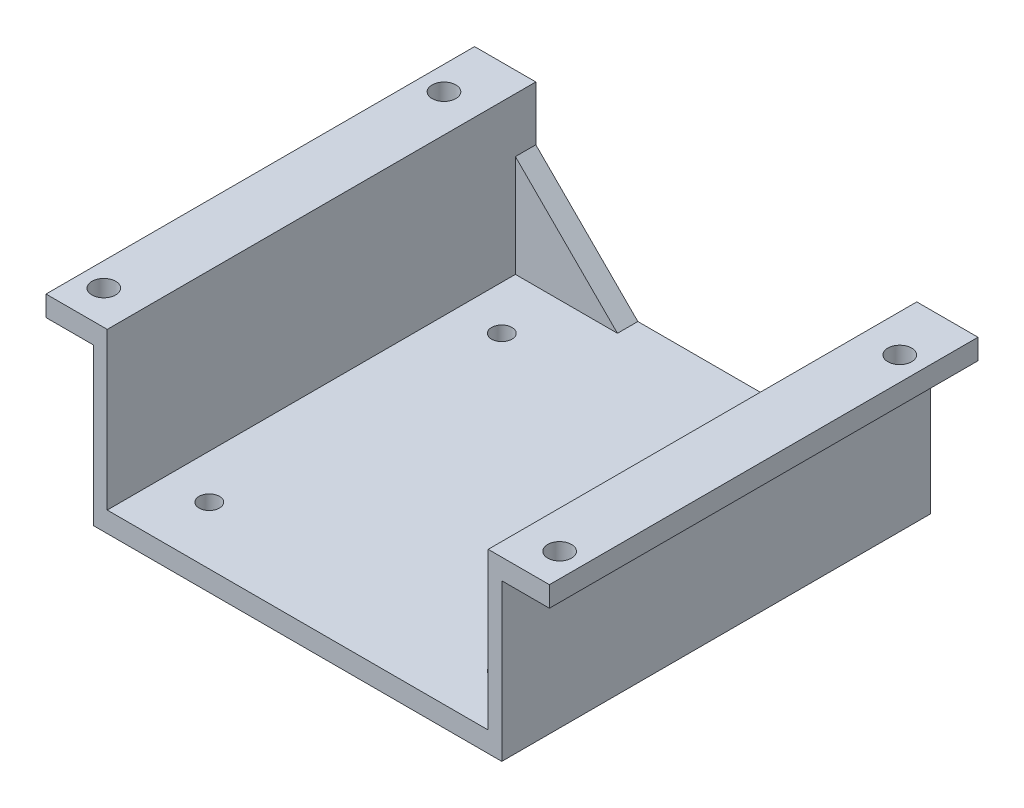
ISO-10303-21;
HEADER;
FILE_DESCRIPTION(('STEP AP214'),'2;1');
FILE_NAME('part.step','',(''),(''),'','','');
FILE_SCHEMA(('AUTOMOTIVE_DESIGN { 1 0 10303 214 1 1 1 1 }'));
ENDSEC;
DATA;
#1=APPLICATION_CONTEXT('core data for automotive mechanical design processes');
#2=APPLICATION_PROTOCOL_DEFINITION('international standard','automotive_design',2000,#1);
#3=PRODUCT_CONTEXT('',#1,'mechanical');
#4=PRODUCT('Part','Part','',(#3));
#5=PRODUCT_RELATED_PRODUCT_CATEGORY('part','',(#4));
#6=PRODUCT_DEFINITION_FORMATION('','',#4);
#7=PRODUCT_DEFINITION_CONTEXT('part definition',#1,'design');
#8=PRODUCT_DEFINITION('design','',#6,#7);
#9=PRODUCT_DEFINITION_SHAPE('','',#8);
#10=(LENGTH_UNIT() NAMED_UNIT(*) SI_UNIT(.MILLI.,.METRE.));
#11=(NAMED_UNIT(*) PLANE_ANGLE_UNIT() SI_UNIT($,.RADIAN.));
#12=(NAMED_UNIT(*) SI_UNIT($,.STERADIAN.) SOLID_ANGLE_UNIT());
#13=UNCERTAINTY_MEASURE_WITH_UNIT(LENGTH_MEASURE(1.E-05),#10,'distance_accuracy_value','');
#14=(GEOMETRIC_REPRESENTATION_CONTEXT(3) GLOBAL_UNCERTAINTY_ASSIGNED_CONTEXT((#13)) GLOBAL_UNIT_ASSIGNED_CONTEXT((#10,
#11,#12)) REPRESENTATION_CONTEXT('',''));
#15=CARTESIAN_POINT('',(0.,0.,0.));
#16=DIRECTION('',(0.,0.,1.));
#17=DIRECTION('',(1.,0.,0.));
#18=AXIS2_PLACEMENT_3D('',#15,#16,#17);
#19=CARTESIAN_POINT('',(30.,3.,30.));
#20=DIRECTION('',(-1.,0.,0.));
#21=DIRECTION('',(0.,0.,1.));
#22=AXIS2_PLACEMENT_3D('',#19,#20,#21);
#23=PLANE('',#22);
#24=DIRECTION('',(0.,0.,-1.));
#25=VECTOR('',#24,1.);
#26=CARTESIAN_POINT('',(30.,23.,30.));
#27=LINE('',#26,#25);
#28=CARTESIAN_POINT('',(30.,23.,30.));
#29=VERTEX_POINT('',#28);
#30=CARTESIAN_POINT('',(30.,23.,-33.));
#31=VERTEX_POINT('',#30);
#32=EDGE_CURVE('E62',#29,#31,#27,.T.);
#33=ORIENTED_EDGE('',*,*,#32,.F.);
#34=DIRECTION('',(0.,-1.,0.));
#35=VECTOR('',#34,1.);
#36=CARTESIAN_POINT('',(30.,3.,30.));
#37=LINE('',#36,#35);
#38=CARTESIAN_POINT('',(30.,0.,30.));
#39=VERTEX_POINT('',#38);
#40=EDGE_CURVE('E47',#29,#39,#37,.T.);
#41=ORIENTED_EDGE('',*,*,#40,.T.);
#42=DIRECTION('',(0.,0.,-1.));
#43=VECTOR('',#42,1.);
#44=CARTESIAN_POINT('',(30.,0.,30.));
#45=LINE('',#44,#43);
#46=CARTESIAN_POINT('',(30.,0.,-33.));
#47=VERTEX_POINT('',#46);
#48=EDGE_CURVE('E272',#39,#47,#45,.T.);
#49=ORIENTED_EDGE('',*,*,#48,.T.);
#50=DIRECTION('',(0.,-1.,0.));
#51=VECTOR('',#50,1.);
#52=CARTESIAN_POINT('',(30.,0.,-33.));
#53=LINE('',#52,#51);
#54=EDGE_CURVE('E298',#31,#47,#53,.T.);
#55=ORIENTED_EDGE('',*,*,#54,.F.);
#56=EDGE_LOOP('',(#33,#41,#49,#55));
#57=FACE_BOUND('',#56,.T.);
#58=ADVANCED_FACE('F39',(#57),#23,.F.);
#59=CARTESIAN_POINT('',(0.,3.,0.));
#60=DIRECTION('',(0.,-1.,0.));
#61=DIRECTION('',(0.,0.,-1.));
#62=AXIS2_PLACEMENT_3D('',#59,#60,#61);
#63=PLANE('',#62);
#64=CARTESIAN_POINT('',(21.5,3.,21.5));
#65=DIRECTION('',(0.,1.,0.));
#66=DIRECTION('',(0.,0.,1.));
#67=AXIS2_PLACEMENT_3D('',#64,#65,#66);
#68=CIRCLE('',#67,1.50000000000002);
#69=CARTESIAN_POINT('',(21.5,3.,23.));
#70=VERTEX_POINT('',#69);
#71=EDGE_CURVE('E266',#70,#70,#68,.T.);
#72=ORIENTED_EDGE('',*,*,#71,.F.);
#73=EDGE_LOOP('',(#72));
#74=FACE_BOUND('',#73,.T.);
#75=CARTESIAN_POINT('',(-21.5,3.,21.5));
#76=DIRECTION('',(0.,1.,0.));
#77=DIRECTION('',(0.,0.,1.));
#78=AXIS2_PLACEMENT_3D('',#75,#76,#77);
#79=CIRCLE('',#78,1.50000000000001);
#80=CARTESIAN_POINT('',(-21.5,3.,23.));
#81=VERTEX_POINT('',#80);
#82=EDGE_CURVE('E260',#81,#81,#79,.T.);
#83=ORIENTED_EDGE('',*,*,#82,.F.);
#84=EDGE_LOOP('',(#83));
#85=FACE_BOUND('',#84,.T.);
#86=CARTESIAN_POINT('',(21.5,3.,-21.5));
#87=DIRECTION('',(0.,1.,0.));
#88=DIRECTION('',(0.,0.,1.));
#89=AXIS2_PLACEMENT_3D('',#86,#87,#88);
#90=CIRCLE('',#89,1.50000000000002);
#91=CARTESIAN_POINT('',(21.5,3.,-20.));
#92=VERTEX_POINT('',#91);
#93=EDGE_CURVE('E254',#92,#92,#90,.T.);
#94=ORIENTED_EDGE('',*,*,#93,.F.);
#95=EDGE_LOOP('',(#94));
#96=FACE_BOUND('',#95,.T.);
#97=CARTESIAN_POINT('',(-21.5,3.,-21.5));
#98=DIRECTION('',(0.,1.,0.));
#99=DIRECTION('',(0.,0.,1.));
#100=AXIS2_PLACEMENT_3D('',#97,#98,#99);
#101=CIRCLE('',#100,1.50000000000001);
#102=CARTESIAN_POINT('',(-21.5,3.,-20.));
#103=VERTEX_POINT('',#102);
#104=EDGE_CURVE('E248',#103,#103,#101,.T.);
#105=ORIENTED_EDGE('',*,*,#104,.F.);
#106=EDGE_LOOP('',(#105));
#107=FACE_BOUND('',#106,.T.);
#108=DIRECTION('',(1.,0.,0.));
#109=VECTOR('',#108,1.);
#110=CARTESIAN_POINT('',(28.,3.,-33.));
#111=LINE('',#110,#109);
#112=CARTESIAN_POINT('',(-13.,3.,-33.));
#113=VERTEX_POINT('',#112);
#114=CARTESIAN_POINT('',(13.,3.,-33.));
#115=VERTEX_POINT('',#114);
#116=EDGE_CURVE('E173',#113,#115,#111,.T.);
#117=ORIENTED_EDGE('',*,*,#116,.F.);
#118=DIRECTION('',(0.,0.,-1.));
#119=VECTOR('',#118,1.);
#120=CARTESIAN_POINT('',(-13.,3.,-30.));
#121=LINE('',#120,#119);
#122=CARTESIAN_POINT('',(-13.,3.,-30.));
#123=VERTEX_POINT('',#122);
#124=EDGE_CURVE('E154',#123,#113,#121,.T.);
#125=ORIENTED_EDGE('',*,*,#124,.F.);
#126=DIRECTION('',(-1.,0.,0.));
#127=VECTOR('',#126,1.);
#128=CARTESIAN_POINT('',(-13.,3.,-30.));
#129=LINE('',#128,#127);
#130=CARTESIAN_POINT('',(-28.,3.,-30.));
#131=VERTEX_POINT('',#130);
#132=EDGE_CURVE('E166',#123,#131,#129,.T.);
#133=ORIENTED_EDGE('',*,*,#132,.T.);
#134=DIRECTION('',(0.,0.,-1.));
#135=VECTOR('',#134,1.);
#136=CARTESIAN_POINT('',(-28.,3.,-30.));
#137=LINE('',#136,#135);
#138=CARTESIAN_POINT('',(-28.,3.,30.));
#139=VERTEX_POINT('',#138);
#140=EDGE_CURVE('E234',#139,#131,#137,.T.);
#141=ORIENTED_EDGE('',*,*,#140,.F.);
#142=DIRECTION('',(1.,0.,0.));
#143=VECTOR('',#142,1.);
#144=CARTESIAN_POINT('',(-30.,3.,30.));
#145=LINE('',#144,#143);
#146=CARTESIAN_POINT('',(28.,3.,30.));
#147=VERTEX_POINT('',#146);
#148=EDGE_CURVE('E273',#139,#147,#145,.T.);
#149=ORIENTED_EDGE('',*,*,#148,.T.);
#150=DIRECTION('',(0.,0.,1.));
#151=VECTOR('',#150,1.);
#152=CARTESIAN_POINT('',(28.,3.,-30.));
#153=LINE('',#152,#151);
#154=CARTESIAN_POINT('',(28.,3.,-30.));
#155=VERTEX_POINT('',#154);
#156=EDGE_CURVE('E236',#155,#147,#153,.T.);
#157=ORIENTED_EDGE('',*,*,#156,.F.);
#158=DIRECTION('',(-1.,0.,0.));
#159=VECTOR('',#158,1.);
#160=CARTESIAN_POINT('',(13.,3.,-30.));
#161=LINE('',#160,#159);
#162=CARTESIAN_POINT('',(13.,3.,-30.));
#163=VERTEX_POINT('',#162);
#164=EDGE_CURVE('E333',#155,#163,#161,.T.);
#165=ORIENTED_EDGE('',*,*,#164,.T.);
#166=DIRECTION('',(0.,0.,-1.));
#167=VECTOR('',#166,1.);
#168=CARTESIAN_POINT('',(13.,3.,-30.));
#169=LINE('',#168,#167);
#170=EDGE_CURVE('E339',#163,#115,#169,.T.);
#171=ORIENTED_EDGE('',*,*,#170,.T.);
#172=EDGE_LOOP('',(#117,#125,#133,#141,#149,#157,#165,#171));
#173=FACE_BOUND('',#172,.T.);
#174=ADVANCED_FACE('F321',(#74,#85,#96,#107,#173),#63,.F.);
#175=CARTESIAN_POINT('',(-30.,3.,30.));
#176=DIRECTION('',(1.,0.,0.));
#177=DIRECTION('',(0.,0.,-1.));
#178=AXIS2_PLACEMENT_3D('',#175,#176,#177);
#179=PLANE('',#178);
#180=DIRECTION('',(0.,-1.,0.));
#181=VECTOR('',#180,1.);
#182=CARTESIAN_POINT('',(-30.,3.,30.));
#183=LINE('',#182,#181);
#184=CARTESIAN_POINT('',(-30.,23.,30.));
#185=VERTEX_POINT('',#184);
#186=CARTESIAN_POINT('',(-30.,0.,30.));
#187=VERTEX_POINT('',#186);
#188=EDGE_CURVE('E11',#185,#187,#183,.T.);
#189=ORIENTED_EDGE('',*,*,#188,.F.);
#190=DIRECTION('',(0.,0.,-1.));
#191=VECTOR('',#190,1.);
#192=CARTESIAN_POINT('',(-30.,23.,30.));
#193=LINE('',#192,#191);
#194=CARTESIAN_POINT('',(-30.,23.,-33.));
#195=VERTEX_POINT('',#194);
#196=EDGE_CURVE('E198',#185,#195,#193,.T.);
#197=ORIENTED_EDGE('',*,*,#196,.T.);
#198=DIRECTION('',(0.,1.,0.));
#199=VECTOR('',#198,1.);
#200=CARTESIAN_POINT('',(-30.,23.,-33.));
#201=LINE('',#200,#199);
#202=CARTESIAN_POINT('',(-30.,0.,-33.));
#203=VERTEX_POINT('',#202);
#204=EDGE_CURVE('E297',#203,#195,#201,.T.);
#205=ORIENTED_EDGE('',*,*,#204,.F.);
#206=DIRECTION('',(0.,0.,1.));
#207=VECTOR('',#206,1.);
#208=CARTESIAN_POINT('',(-30.,0.,30.));
#209=LINE('',#208,#207);
#210=EDGE_CURVE('E278',#203,#187,#209,.T.);
#211=ORIENTED_EDGE('',*,*,#210,.T.);
#212=EDGE_LOOP('',(#189,#197,#205,#211));
#213=FACE_BOUND('',#212,.T.);
#214=ADVANCED_FACE('F385',(#213),#179,.F.);
#215=CARTESIAN_POINT('',(-30.,3.,30.));
#216=DIRECTION('',(0.,0.,-1.));
#217=DIRECTION('',(-1.,0.,0.));
#218=AXIS2_PLACEMENT_3D('',#215,#216,#217);
#219=PLANE('',#218);
#220=DIRECTION('',(1.,0.,0.));
#221=VECTOR('',#220,1.);
#222=CARTESIAN_POINT('',(-30.,0.,30.));
#223=LINE('',#222,#221);
#224=EDGE_CURVE('E276',#187,#39,#223,.T.);
#225=ORIENTED_EDGE('',*,*,#224,.T.);
#226=ORIENTED_EDGE('',*,*,#40,.F.);
#227=DIRECTION('',(-1.,0.,0.));
#228=VECTOR('',#227,1.);
#229=CARTESIAN_POINT('',(37.,23.,30.));
#230=LINE('',#229,#228);
#231=CARTESIAN_POINT('',(37.,23.,30.));
#232=VERTEX_POINT('',#231);
#233=EDGE_CURVE('E226',#232,#29,#230,.T.);
#234=ORIENTED_EDGE('',*,*,#233,.F.);
#235=DIRECTION('',(0.,-1.,0.));
#236=VECTOR('',#235,1.);
#237=CARTESIAN_POINT('',(37.,26.,30.));
#238=LINE('',#237,#236);
#239=CARTESIAN_POINT('',(37.,26.,30.));
#240=VERTEX_POINT('',#239);
#241=EDGE_CURVE('E218',#240,#232,#238,.T.);
#242=ORIENTED_EDGE('',*,*,#241,.F.);
#243=DIRECTION('',(1.,0.,0.));
#244=VECTOR('',#243,1.);
#245=CARTESIAN_POINT('',(30.,26.,30.));
#246=LINE('',#245,#244);
#247=CARTESIAN_POINT('',(28.,26.,30.));
#248=VERTEX_POINT('',#247);
#249=EDGE_CURVE('E242',#248,#240,#246,.T.);
#250=ORIENTED_EDGE('',*,*,#249,.F.);
#251=DIRECTION('',(0.,-1.,0.));
#252=VECTOR('',#251,1.);
#253=CARTESIAN_POINT('',(28.,26.,30.));
#254=LINE('',#253,#252);
#255=EDGE_CURVE('E244',#248,#147,#254,.T.);
#256=ORIENTED_EDGE('',*,*,#255,.T.);
#257=ORIENTED_EDGE('',*,*,#148,.F.);
#258=DIRECTION('',(0.,-1.,0.));
#259=VECTOR('',#258,1.);
#260=CARTESIAN_POINT('',(-28.,26.,30.));
#261=LINE('',#260,#259);
#262=CARTESIAN_POINT('',(-28.,26.,30.));
#263=VERTEX_POINT('',#262);
#264=EDGE_CURVE('E230',#263,#139,#261,.T.);
#265=ORIENTED_EDGE('',*,*,#264,.F.);
#266=DIRECTION('',(1.,0.,0.));
#267=VECTOR('',#266,1.);
#268=CARTESIAN_POINT('',(-30.,26.,30.));
#269=LINE('',#268,#267);
#270=CARTESIAN_POINT('',(-37.,26.,30.));
#271=VERTEX_POINT('',#270);
#272=EDGE_CURVE('E237',#271,#263,#269,.T.);
#273=ORIENTED_EDGE('',*,*,#272,.F.);
#274=DIRECTION('',(0.,-1.,0.));
#275=VECTOR('',#274,1.);
#276=CARTESIAN_POINT('',(-37.,26.,30.));
#277=LINE('',#276,#275);
#278=CARTESIAN_POINT('',(-37.,23.,30.));
#279=VERTEX_POINT('',#278);
#280=EDGE_CURVE('E194',#271,#279,#277,.T.);
#281=ORIENTED_EDGE('',*,*,#280,.T.);
#282=DIRECTION('',(1.,0.,0.));
#283=VECTOR('',#282,1.);
#284=CARTESIAN_POINT('',(-37.,23.,30.));
#285=LINE('',#284,#283);
#286=EDGE_CURVE('E203',#279,#185,#285,.T.);
#287=ORIENTED_EDGE('',*,*,#286,.T.);
#288=ORIENTED_EDGE('',*,*,#188,.T.);
#289=EDGE_LOOP('',(#225,#226,#234,#242,#250,#256,#257,#265,#273,#281,#287,#288));
#290=FACE_BOUND('',#289,.T.);
#291=ADVANCED_FACE('F288',(#290),#219,.F.);
#292=CARTESIAN_POINT('',(0.,0.,0.));
#293=DIRECTION('',(0.,-1.,0.));
#294=DIRECTION('',(0.,0.,-1.));
#295=AXIS2_PLACEMENT_3D('',#292,#293,#294);
#296=PLANE('',#295);
#297=CARTESIAN_POINT('',(-21.5,0.,-21.5));
#298=DIRECTION('',(0.,-1.,0.));
#299=DIRECTION('',(0.,0.,-1.));
#300=AXIS2_PLACEMENT_3D('',#297,#298,#299);
#301=CIRCLE('',#300,1.50000000000001);
#302=CARTESIAN_POINT('',(-21.5,0.,-23.));
#303=VERTEX_POINT('',#302);
#304=EDGE_CURVE('E251',#303,#303,#301,.T.);
#305=ORIENTED_EDGE('',*,*,#304,.F.);
#306=EDGE_LOOP('',(#305));
#307=FACE_BOUND('',#306,.T.);
#308=CARTESIAN_POINT('',(21.5,0.,-21.5));
#309=DIRECTION('',(0.,-1.,0.));
#310=DIRECTION('',(0.,0.,-1.));
#311=AXIS2_PLACEMENT_3D('',#308,#309,#310);
#312=CIRCLE('',#311,1.50000000000001);
#313=CARTESIAN_POINT('',(21.5,0.,-23.));
#314=VERTEX_POINT('',#313);
#315=EDGE_CURVE('E257',#314,#314,#312,.T.);
#316=ORIENTED_EDGE('',*,*,#315,.F.);
#317=EDGE_LOOP('',(#316));
#318=FACE_BOUND('',#317,.T.);
#319=CARTESIAN_POINT('',(-21.5,0.,21.5));
#320=DIRECTION('',(0.,-1.,0.));
#321=DIRECTION('',(0.,0.,-1.));
#322=AXIS2_PLACEMENT_3D('',#319,#320,#321);
#323=CIRCLE('',#322,1.50000000000001);
#324=CARTESIAN_POINT('',(-21.5,0.,20.));
#325=VERTEX_POINT('',#324);
#326=EDGE_CURVE('E263',#325,#325,#323,.T.);
#327=ORIENTED_EDGE('',*,*,#326,.F.);
#328=EDGE_LOOP('',(#327));
#329=FACE_BOUND('',#328,.T.);
#330=CARTESIAN_POINT('',(21.5,0.,21.5));
#331=DIRECTION('',(0.,-1.,0.));
#332=DIRECTION('',(0.,0.,-1.));
#333=AXIS2_PLACEMENT_3D('',#330,#331,#332);
#334=CIRCLE('',#333,1.50000000000001);
#335=CARTESIAN_POINT('',(21.5,0.,20.));
#336=VERTEX_POINT('',#335);
#337=EDGE_CURVE('E269',#336,#336,#334,.T.);
#338=ORIENTED_EDGE('',*,*,#337,.F.);
#339=EDGE_LOOP('',(#338));
#340=FACE_BOUND('',#339,.T.);
#341=ORIENTED_EDGE('',*,*,#48,.F.);
#342=ORIENTED_EDGE('',*,*,#224,.F.);
#343=ORIENTED_EDGE('',*,*,#210,.F.);
#344=DIRECTION('',(-1.,0.,0.));
#345=VECTOR('',#344,1.);
#346=CARTESIAN_POINT('',(-30.,0.,-33.));
#347=LINE('',#346,#345);
#348=EDGE_CURVE('E294',#47,#203,#347,.T.);
#349=ORIENTED_EDGE('',*,*,#348,.F.);
#350=EDGE_LOOP('',(#341,#342,#343,#349));
#351=FACE_BOUND('',#350,.T.);
#352=ADVANCED_FACE('F292',(#307,#318,#329,#340,#351),#296,.T.);
#353=CARTESIAN_POINT('',(21.5,3.,21.5));
#354=DIRECTION('',(0.,1.,0.));
#355=DIRECTION('',(0.,0.,1.));
#356=AXIS2_PLACEMENT_3D('',#353,#354,#355);
#357=CYLINDRICAL_SURFACE('',#356,1.50000000000001);
#358=ORIENTED_EDGE('',*,*,#71,.T.);
#359=EDGE_LOOP('',(#358));
#360=FACE_BOUND('',#359,.T.);
#361=ORIENTED_EDGE('',*,*,#337,.T.);
#362=EDGE_LOOP('',(#361));
#363=FACE_BOUND('',#362,.T.);
#364=ADVANCED_FACE('F397',(#360,#363),#357,.F.);
#365=CARTESIAN_POINT('',(-21.5,3.,21.5));
#366=DIRECTION('',(0.,1.,0.));
#367=DIRECTION('',(0.,0.,1.));
#368=AXIS2_PLACEMENT_3D('',#365,#366,#367);
#369=CYLINDRICAL_SURFACE('',#368,1.50000000000001);
#370=ORIENTED_EDGE('',*,*,#82,.T.);
#371=EDGE_LOOP('',(#370));
#372=FACE_BOUND('',#371,.T.);
#373=ORIENTED_EDGE('',*,*,#326,.T.);
#374=EDGE_LOOP('',(#373));
#375=FACE_BOUND('',#374,.T.);
#376=ADVANCED_FACE('F618',(#372,#375),#369,.F.);
#377=CARTESIAN_POINT('',(21.5,3.,-21.5));
#378=DIRECTION('',(0.,1.,0.));
#379=DIRECTION('',(0.,0.,1.));
#380=AXIS2_PLACEMENT_3D('',#377,#378,#379);
#381=CYLINDRICAL_SURFACE('',#380,1.50000000000001);
#382=ORIENTED_EDGE('',*,*,#93,.T.);
#383=EDGE_LOOP('',(#382));
#384=FACE_BOUND('',#383,.T.);
#385=ORIENTED_EDGE('',*,*,#315,.T.);
#386=EDGE_LOOP('',(#385));
#387=FACE_BOUND('',#386,.T.);
#388=ADVANCED_FACE('F610',(#384,#387),#381,.F.);
#389=CARTESIAN_POINT('',(-21.5,3.,-21.5));
#390=DIRECTION('',(0.,1.,0.));
#391=DIRECTION('',(0.,0.,1.));
#392=AXIS2_PLACEMENT_3D('',#389,#390,#391);
#393=CYLINDRICAL_SURFACE('',#392,1.50000000000001);
#394=ORIENTED_EDGE('',*,*,#104,.T.);
#395=EDGE_LOOP('',(#394));
#396=FACE_BOUND('',#395,.T.);
#397=ORIENTED_EDGE('',*,*,#304,.T.);
#398=EDGE_LOOP('',(#397));
#399=FACE_BOUND('',#398,.T.);
#400=ADVANCED_FACE('F473',(#396,#399),#393,.F.);
#401=CARTESIAN_POINT('',(28.,26.,-30.));
#402=DIRECTION('',(1.,0.,0.));
#403=DIRECTION('',(0.,0.,-1.));
#404=AXIS2_PLACEMENT_3D('',#401,#402,#403);
#405=PLANE('',#404);
#406=DIRECTION('',(0.,1.,0.));
#407=VECTOR('',#406,1.);
#408=CARTESIAN_POINT('',(28.,26.,-33.));
#409=LINE('',#408,#407);
#410=CARTESIAN_POINT('',(28.,17.9999999999998,-33.));
#411=VERTEX_POINT('',#410);
#412=CARTESIAN_POINT('',(28.,26.,-33.));
#413=VERTEX_POINT('',#412);
#414=EDGE_CURVE('E175',#411,#413,#409,.T.);
#415=ORIENTED_EDGE('',*,*,#414,.F.);
#416=DIRECTION('',(0.,0.,-1.));
#417=VECTOR('',#416,1.);
#418=CARTESIAN_POINT('',(28.,17.9999999999998,-30.));
#419=LINE('',#418,#417);
#420=CARTESIAN_POINT('',(28.,17.9999999999998,-30.));
#421=VERTEX_POINT('',#420);
#422=EDGE_CURVE('E342',#421,#411,#419,.T.);
#423=ORIENTED_EDGE('',*,*,#422,.F.);
#424=DIRECTION('',(0.,-1.,0.));
#425=VECTOR('',#424,1.);
#426=CARTESIAN_POINT('',(28.,3.,-30.));
#427=LINE('',#426,#425);
#428=EDGE_CURVE('E330',#421,#155,#427,.T.);
#429=ORIENTED_EDGE('',*,*,#428,.T.);
#430=ORIENTED_EDGE('',*,*,#156,.T.);
#431=ORIENTED_EDGE('',*,*,#255,.F.);
#432=DIRECTION('',(0.,0.,1.));
#433=VECTOR('',#432,1.);
#434=CARTESIAN_POINT('',(28.,26.,-30.));
#435=LINE('',#434,#433);
#436=EDGE_CURVE('E240',#413,#248,#435,.T.);
#437=ORIENTED_EDGE('',*,*,#436,.F.);
#438=EDGE_LOOP('',(#415,#423,#429,#430,#431,#437));
#439=FACE_BOUND('',#438,.T.);
#440=ADVANCED_FACE('F364',(#439),#405,.F.);
#441=CARTESIAN_POINT('',(0.,26.,0.));
#442=DIRECTION('',(0.,-1.,0.));
#443=DIRECTION('',(0.,0.,-1.));
#444=AXIS2_PLACEMENT_3D('',#441,#442,#443);
#445=PLANE('',#444);
#446=CARTESIAN_POINT('',(33.5,26.,-25.));
#447=DIRECTION('',(0.,1.,0.));
#448=DIRECTION('',(0.,0.,1.));
#449=AXIS2_PLACEMENT_3D('',#446,#447,#448);
#450=CIRCLE('',#449,1.75000000000002);
#451=CARTESIAN_POINT('',(33.5,26.,-23.25));
#452=VERTEX_POINT('',#451);
#453=EDGE_CURVE('E206',#452,#452,#450,.T.);
#454=ORIENTED_EDGE('',*,*,#453,.F.);
#455=EDGE_LOOP('',(#454));
#456=FACE_BOUND('',#455,.T.);
#457=CARTESIAN_POINT('',(33.5,26.,25.));
#458=DIRECTION('',(0.,1.,0.));
#459=DIRECTION('',(0.,0.,1.));
#460=AXIS2_PLACEMENT_3D('',#457,#458,#459);
#461=CIRCLE('',#460,1.75000000000002);
#462=CARTESIAN_POINT('',(33.5,26.,26.75));
#463=VERTEX_POINT('',#462);
#464=EDGE_CURVE('E212',#463,#463,#461,.T.);
#465=ORIENTED_EDGE('',*,*,#464,.F.);
#466=EDGE_LOOP('',(#465));
#467=FACE_BOUND('',#466,.T.);
#468=ORIENTED_EDGE('',*,*,#249,.T.);
#469=DIRECTION('',(0.,0.,1.));
#470=VECTOR('',#469,1.);
#471=CARTESIAN_POINT('',(37.,26.,30.));
#472=LINE('',#471,#470);
#473=CARTESIAN_POINT('',(37.,26.,-33.));
#474=VERTEX_POINT('',#473);
#475=EDGE_CURVE('E223',#474,#240,#472,.T.);
#476=ORIENTED_EDGE('',*,*,#475,.F.);
#477=DIRECTION('',(1.,0.,0.));
#478=VECTOR('',#477,1.);
#479=CARTESIAN_POINT('',(37.,26.,-33.));
#480=LINE('',#479,#478);
#481=EDGE_CURVE('E182',#413,#474,#480,.T.);
#482=ORIENTED_EDGE('',*,*,#481,.F.);
#483=ORIENTED_EDGE('',*,*,#436,.T.);
#484=EDGE_LOOP('',(#468,#476,#482,#483));
#485=FACE_BOUND('',#484,.T.);
#486=ADVANCED_FACE('F358',(#456,#467,#485),#445,.F.);
#487=CARTESIAN_POINT('',(-28.,26.,-30.));
#488=DIRECTION('',(-1.,0.,0.));
#489=DIRECTION('',(0.,0.,1.));
#490=AXIS2_PLACEMENT_3D('',#487,#488,#489);
#491=PLANE('',#490);
#492=DIRECTION('',(0.,1.,0.));
#493=VECTOR('',#492,1.);
#494=CARTESIAN_POINT('',(-28.,3.,-30.));
#495=LINE('',#494,#493);
#496=CARTESIAN_POINT('',(-28.,17.9999999999999,-30.));
#497=VERTEX_POINT('',#496);
#498=EDGE_CURVE('E157',#131,#497,#495,.T.);
#499=ORIENTED_EDGE('',*,*,#498,.T.);
#500=DIRECTION('',(0.,0.,-1.));
#501=VECTOR('',#500,1.);
#502=CARTESIAN_POINT('',(-28.,17.9999999999999,-30.));
#503=LINE('',#502,#501);
#504=CARTESIAN_POINT('',(-28.,17.9999999999999,-33.));
#505=VERTEX_POINT('',#504);
#506=EDGE_CURVE('E151',#497,#505,#503,.T.);
#507=ORIENTED_EDGE('',*,*,#506,.T.);
#508=DIRECTION('',(0.,-1.,0.));
#509=VECTOR('',#508,1.);
#510=CARTESIAN_POINT('',(-28.,3.,-33.));
#511=LINE('',#510,#509);
#512=CARTESIAN_POINT('',(-28.,26.,-33.));
#513=VERTEX_POINT('',#512);
#514=EDGE_CURVE('E164',#513,#505,#511,.T.);
#515=ORIENTED_EDGE('',*,*,#514,.F.);
#516=DIRECTION('',(0.,0.,-1.));
#517=VECTOR('',#516,1.);
#518=CARTESIAN_POINT('',(-28.,26.,-30.));
#519=LINE('',#518,#517);
#520=EDGE_CURVE('E233',#263,#513,#519,.T.);
#521=ORIENTED_EDGE('',*,*,#520,.F.);
#522=ORIENTED_EDGE('',*,*,#264,.T.);
#523=ORIENTED_EDGE('',*,*,#140,.T.);
#524=EDGE_LOOP('',(#499,#507,#515,#521,#522,#523));
#525=FACE_BOUND('',#524,.T.);
#526=ADVANCED_FACE('F162',(#525),#491,.F.);
#527=CARTESIAN_POINT('',(0.,26.,0.));
#528=DIRECTION('',(0.,1.,0.));
#529=DIRECTION('',(0.,0.,1.));
#530=AXIS2_PLACEMENT_3D('',#527,#528,#529);
#531=PLANE('',#530);
#532=CARTESIAN_POINT('',(-33.5,26.,-25.));
#533=DIRECTION('',(0.,1.,0.));
#534=DIRECTION('',(0.,0.,1.));
#535=AXIS2_PLACEMENT_3D('',#532,#533,#534);
#536=CIRCLE('',#535,1.75000000000002);
#537=CARTESIAN_POINT('',(-33.5,26.,-23.25));
#538=VERTEX_POINT('',#537);
#539=EDGE_CURVE('E185',#538,#538,#536,.T.);
#540=ORIENTED_EDGE('',*,*,#539,.F.);
#541=EDGE_LOOP('',(#540));
#542=FACE_BOUND('',#541,.T.);
#543=CARTESIAN_POINT('',(-33.5,26.,25.));
#544=DIRECTION('',(0.,1.,0.));
#545=DIRECTION('',(0.,0.,1.));
#546=AXIS2_PLACEMENT_3D('',#543,#544,#545);
#547=CIRCLE('',#546,1.75000000000002);
#548=CARTESIAN_POINT('',(-33.5,26.,26.75));
#549=VERTEX_POINT('',#548);
#550=EDGE_CURVE('E191',#549,#549,#547,.T.);
#551=ORIENTED_EDGE('',*,*,#550,.F.);
#552=EDGE_LOOP('',(#551));
#553=FACE_BOUND('',#552,.T.);
#554=ORIENTED_EDGE('',*,*,#520,.T.);
#555=DIRECTION('',(1.,0.,0.));
#556=VECTOR('',#555,1.);
#557=CARTESIAN_POINT('',(-28.,26.,-33.));
#558=LINE('',#557,#556);
#559=CARTESIAN_POINT('',(-37.,26.,-33.));
#560=VERTEX_POINT('',#559);
#561=EDGE_CURVE('E172',#560,#513,#558,.T.);
#562=ORIENTED_EDGE('',*,*,#561,.F.);
#563=DIRECTION('',(0.,0.,1.));
#564=VECTOR('',#563,1.);
#565=CARTESIAN_POINT('',(-37.,26.,30.));
#566=LINE('',#565,#564);
#567=EDGE_CURVE('E197',#560,#271,#566,.T.);
#568=ORIENTED_EDGE('',*,*,#567,.T.);
#569=ORIENTED_EDGE('',*,*,#272,.T.);
#570=EDGE_LOOP('',(#554,#562,#568,#569));
#571=FACE_BOUND('',#570,.T.);
#572=ADVANCED_FACE('F312',(#542,#553,#571),#531,.T.);
#573=CARTESIAN_POINT('',(37.,23.,30.));
#574=DIRECTION('',(0.,1.,0.));
#575=DIRECTION('',(0.,0.,1.));
#576=AXIS2_PLACEMENT_3D('',#573,#574,#575);
#577=PLANE('',#576);
#578=CARTESIAN_POINT('',(33.5,23.,-25.));
#579=DIRECTION('',(0.,1.,0.));
#580=DIRECTION('',(0.,0.,1.));
#581=AXIS2_PLACEMENT_3D('',#578,#579,#580);
#582=CIRCLE('',#581,1.75000000000001);
#583=CARTESIAN_POINT('',(33.5,23.,-23.25));
#584=VERTEX_POINT('',#583);
#585=EDGE_CURVE('E209',#584,#584,#582,.T.);
#586=ORIENTED_EDGE('',*,*,#585,.T.);
#587=EDGE_LOOP('',(#586));
#588=FACE_BOUND('',#587,.T.);
#589=CARTESIAN_POINT('',(33.5,23.,25.));
#590=DIRECTION('',(0.,1.,0.));
#591=DIRECTION('',(0.,0.,1.));
#592=AXIS2_PLACEMENT_3D('',#589,#590,#591);
#593=CIRCLE('',#592,1.75000000000001);
#594=CARTESIAN_POINT('',(33.5,23.,26.75));
#595=VERTEX_POINT('',#594);
#596=EDGE_CURVE('E215',#595,#595,#593,.T.);
#597=ORIENTED_EDGE('',*,*,#596,.T.);
#598=EDGE_LOOP('',(#597));
#599=FACE_BOUND('',#598,.T.);
#600=ORIENTED_EDGE('',*,*,#32,.T.);
#601=DIRECTION('',(-1.,0.,0.));
#602=VECTOR('',#601,1.);
#603=CARTESIAN_POINT('',(30.,23.,-33.));
#604=LINE('',#603,#602);
#605=CARTESIAN_POINT('',(37.,23.,-33.));
#606=VERTEX_POINT('',#605);
#607=EDGE_CURVE('E302',#606,#31,#604,.T.);
#608=ORIENTED_EDGE('',*,*,#607,.F.);
#609=DIRECTION('',(0.,0.,-1.));
#610=VECTOR('',#609,1.);
#611=CARTESIAN_POINT('',(37.,23.,30.));
#612=LINE('',#611,#610);
#613=EDGE_CURVE('E221',#232,#606,#612,.T.);
#614=ORIENTED_EDGE('',*,*,#613,.F.);
#615=ORIENTED_EDGE('',*,*,#233,.T.);
#616=EDGE_LOOP('',(#600,#608,#614,#615));
#617=FACE_BOUND('',#616,.T.);
#618=ADVANCED_FACE('F352',(#588,#599,#617),#577,.F.);
#619=CARTESIAN_POINT('',(37.,0.,0.));
#620=DIRECTION('',(1.,0.,0.));
#621=DIRECTION('',(0.,0.,-1.));
#622=AXIS2_PLACEMENT_3D('',#619,#620,#621);
#623=PLANE('',#622);
#624=ORIENTED_EDGE('',*,*,#241,.T.);
#625=ORIENTED_EDGE('',*,*,#613,.T.);
#626=DIRECTION('',(0.,-1.,0.));
#627=VECTOR('',#626,1.);
#628=CARTESIAN_POINT('',(37.,23.,-33.));
#629=LINE('',#628,#627);
#630=EDGE_CURVE('E344',#474,#606,#629,.T.);
#631=ORIENTED_EDGE('',*,*,#630,.F.);
#632=ORIENTED_EDGE('',*,*,#475,.T.);
#633=EDGE_LOOP('',(#624,#625,#631,#632));
#634=FACE_BOUND('',#633,.T.);
#635=ADVANCED_FACE('F355',(#634),#623,.T.);
#636=CARTESIAN_POINT('',(33.5,26.,25.));
#637=DIRECTION('',(0.,1.,0.));
#638=DIRECTION('',(0.,0.,1.));
#639=AXIS2_PLACEMENT_3D('',#636,#637,#638);
#640=CYLINDRICAL_SURFACE('',#639,1.75000000000001);
#641=ORIENTED_EDGE('',*,*,#464,.T.);
#642=EDGE_LOOP('',(#641));
#643=FACE_BOUND('',#642,.T.);
#644=ORIENTED_EDGE('',*,*,#596,.F.);
#645=EDGE_LOOP('',(#644));
#646=FACE_BOUND('',#645,.T.);
#647=ADVANCED_FACE('F525',(#643,#646),#640,.F.);
#648=CARTESIAN_POINT('',(33.5,26.,-25.));
#649=DIRECTION('',(0.,1.,0.));
#650=DIRECTION('',(0.,0.,1.));
#651=AXIS2_PLACEMENT_3D('',#648,#649,#650);
#652=CYLINDRICAL_SURFACE('',#651,1.75000000000001);
#653=ORIENTED_EDGE('',*,*,#453,.T.);
#654=EDGE_LOOP('',(#653));
#655=FACE_BOUND('',#654,.T.);
#656=ORIENTED_EDGE('',*,*,#585,.F.);
#657=EDGE_LOOP('',(#656));
#658=FACE_BOUND('',#657,.T.);
#659=ADVANCED_FACE('F412',(#655,#658),#652,.F.);
#660=CARTESIAN_POINT('',(-37.,23.,30.));
#661=DIRECTION('',(0.,-1.,0.));
#662=DIRECTION('',(0.,0.,-1.));
#663=AXIS2_PLACEMENT_3D('',#660,#661,#662);
#664=PLANE('',#663);
#665=CARTESIAN_POINT('',(-33.5,23.,-25.));
#666=DIRECTION('',(0.,-1.,0.));
#667=DIRECTION('',(0.,0.,-1.));
#668=AXIS2_PLACEMENT_3D('',#665,#666,#667);
#669=CIRCLE('',#668,1.75000000000001);
#670=CARTESIAN_POINT('',(-33.5,23.,-26.75));
#671=VERTEX_POINT('',#670);
#672=EDGE_CURVE('E188',#671,#671,#669,.T.);
#673=ORIENTED_EDGE('',*,*,#672,.F.);
#674=EDGE_LOOP('',(#673));
#675=FACE_BOUND('',#674,.T.);
#676=CARTESIAN_POINT('',(-33.5,23.,25.));
#677=DIRECTION('',(0.,-1.,0.));
#678=DIRECTION('',(0.,0.,-1.));
#679=AXIS2_PLACEMENT_3D('',#676,#677,#678);
#680=CIRCLE('',#679,1.75000000000001);
#681=CARTESIAN_POINT('',(-33.5,23.,23.25));
#682=VERTEX_POINT('',#681);
#683=EDGE_CURVE('E42',#682,#682,#680,.T.);
#684=ORIENTED_EDGE('',*,*,#683,.F.);
#685=EDGE_LOOP('',(#684));
#686=FACE_BOUND('',#685,.T.);
#687=ORIENTED_EDGE('',*,*,#196,.F.);
#688=ORIENTED_EDGE('',*,*,#286,.F.);
#689=DIRECTION('',(0.,0.,-1.));
#690=VECTOR('',#689,1.);
#691=CARTESIAN_POINT('',(-37.,23.,30.));
#692=LINE('',#691,#690);
#693=CARTESIAN_POINT('',(-37.,23.,-33.));
#694=VERTEX_POINT('',#693);
#695=EDGE_CURVE('E201',#279,#694,#692,.T.);
#696=ORIENTED_EDGE('',*,*,#695,.T.);
#697=DIRECTION('',(-1.,0.,0.));
#698=VECTOR('',#697,1.);
#699=CARTESIAN_POINT('',(-37.,23.,-33.));
#700=LINE('',#699,#698);
#701=EDGE_CURVE('E300',#195,#694,#700,.T.);
#702=ORIENTED_EDGE('',*,*,#701,.F.);
#703=EDGE_LOOP('',(#687,#688,#696,#702));
#704=FACE_BOUND('',#703,.T.);
#705=ADVANCED_FACE('F533',(#675,#686,#704),#664,.T.);
#706=CARTESIAN_POINT('',(-37.,0.,0.));
#707=DIRECTION('',(-1.,0.,0.));
#708=DIRECTION('',(0.,0.,-1.));
#709=AXIS2_PLACEMENT_3D('',#706,#707,#708);
#710=PLANE('',#709);
#711=ORIENTED_EDGE('',*,*,#280,.F.);
#712=ORIENTED_EDGE('',*,*,#567,.F.);
#713=DIRECTION('',(0.,1.,0.));
#714=VECTOR('',#713,1.);
#715=CARTESIAN_POINT('',(-37.,26.,-33.));
#716=LINE('',#715,#714);
#717=EDGE_CURVE('E177',#694,#560,#716,.T.);
#718=ORIENTED_EDGE('',*,*,#717,.F.);
#719=ORIENTED_EDGE('',*,*,#695,.F.);
#720=EDGE_LOOP('',(#711,#712,#718,#719));
#721=FACE_BOUND('',#720,.T.);
#722=ADVANCED_FACE('F418',(#721),#710,.T.);
#723=CARTESIAN_POINT('',(-33.5,26.,25.));
#724=DIRECTION('',(0.,1.,0.));
#725=DIRECTION('',(0.,0.,1.));
#726=AXIS2_PLACEMENT_3D('',#723,#724,#725);
#727=CYLINDRICAL_SURFACE('',#726,1.75000000000001);
#728=ORIENTED_EDGE('',*,*,#683,.T.);
#729=EDGE_LOOP('',(#728));
#730=FACE_BOUND('',#729,.T.);
#731=ORIENTED_EDGE('',*,*,#550,.T.);
#732=EDGE_LOOP('',(#731));
#733=FACE_BOUND('',#732,.T.);
#734=ADVANCED_FACE('F415',(#730,#733),#727,.F.);
#735=CARTESIAN_POINT('',(-33.5,26.,-25.));
#736=DIRECTION('',(0.,1.,0.));
#737=DIRECTION('',(0.,0.,1.));
#738=AXIS2_PLACEMENT_3D('',#735,#736,#737);
#739=CYLINDRICAL_SURFACE('',#738,1.75000000000001);
#740=ORIENTED_EDGE('',*,*,#672,.T.);
#741=EDGE_LOOP('',(#740));
#742=FACE_BOUND('',#741,.T.);
#743=ORIENTED_EDGE('',*,*,#539,.T.);
#744=EDGE_LOOP('',(#743));
#745=FACE_BOUND('',#744,.T.);
#746=ADVANCED_FACE('F377',(#742,#745),#739,.F.);
#747=CARTESIAN_POINT('',(0.,0.,-33.));
#748=DIRECTION('',(0.,0.,1.));
#749=DIRECTION('',(1.,0.,0.));
#750=AXIS2_PLACEMENT_3D('',#747,#748,#749);
#751=PLANE('',#750);
#752=ORIENTED_EDGE('',*,*,#514,.T.);
#753=DIRECTION('',(0.707106781186551,-0.707106781186544,0.));
#754=VECTOR('',#753,1.);
#755=CARTESIAN_POINT('',(-28.,17.9999999999999,-33.));
#756=LINE('',#755,#754);
#757=EDGE_CURVE('E54',#505,#113,#756,.T.);
#758=ORIENTED_EDGE('',*,*,#757,.T.);
#759=ORIENTED_EDGE('',*,*,#116,.T.);
#760=DIRECTION('',(0.707106781186551,0.707106781186544,0.));
#761=VECTOR('',#760,1.);
#762=CARTESIAN_POINT('',(28.,17.9999999999998,-33.));
#763=LINE('',#762,#761);
#764=EDGE_CURVE('E156',#115,#411,#763,.T.);
#765=ORIENTED_EDGE('',*,*,#764,.T.);
#766=ORIENTED_EDGE('',*,*,#414,.T.);
#767=ORIENTED_EDGE('',*,*,#481,.T.);
#768=ORIENTED_EDGE('',*,*,#630,.T.);
#769=ORIENTED_EDGE('',*,*,#607,.T.);
#770=ORIENTED_EDGE('',*,*,#54,.T.);
#771=ORIENTED_EDGE('',*,*,#348,.T.);
#772=ORIENTED_EDGE('',*,*,#204,.T.);
#773=ORIENTED_EDGE('',*,*,#701,.T.);
#774=ORIENTED_EDGE('',*,*,#717,.T.);
#775=ORIENTED_EDGE('',*,*,#561,.T.);
#776=EDGE_LOOP('',(#752,#758,#759,#765,#766,#767,#768,#769,#770,#771,#772,#773,#774,#775));
#777=FACE_BOUND('',#776,.T.);
#778=ADVANCED_FACE('F169',(#777),#751,.F.);
#779=CARTESIAN_POINT('',(28.,17.9999999999998,-30.));
#780=DIRECTION('',(-0.707106781186544,0.707106781186551,0.));
#781=DIRECTION('',(-0.707106781186551,-0.707106781186544,0.));
#782=AXIS2_PLACEMENT_3D('',#779,#780,#781);
#783=PLANE('',#782);
#784=ORIENTED_EDGE('',*,*,#764,.F.);
#785=ORIENTED_EDGE('',*,*,#170,.F.);
#786=DIRECTION('',(0.707106781186551,0.707106781186544,0.));
#787=VECTOR('',#786,1.);
#788=CARTESIAN_POINT('',(28.,17.9999999999998,-30.));
#789=LINE('',#788,#787);
#790=EDGE_CURVE('E336',#163,#421,#789,.T.);
#791=ORIENTED_EDGE('',*,*,#790,.T.);
#792=ORIENTED_EDGE('',*,*,#422,.T.);
#793=EDGE_LOOP('',(#784,#785,#791,#792));
#794=FACE_BOUND('',#793,.T.);
#795=ADVANCED_FACE('F369',(#794),#783,.T.);
#796=CARTESIAN_POINT('',(0.,0.,-30.));
#797=DIRECTION('',(0.,0.,-1.));
#798=DIRECTION('',(-1.,0.,0.));
#799=AXIS2_PLACEMENT_3D('',#796,#797,#798);
#800=PLANE('',#799);
#801=ORIENTED_EDGE('',*,*,#428,.F.);
#802=ORIENTED_EDGE('',*,*,#790,.F.);
#803=ORIENTED_EDGE('',*,*,#164,.F.);
#804=EDGE_LOOP('',(#801,#802,#803));
#805=FACE_BOUND('',#804,.T.);
#806=ADVANCED_FACE('F367',(#805),#800,.F.);
#807=CARTESIAN_POINT('',(-28.,17.9999999999999,-30.));
#808=DIRECTION('',(0.707106781186544,0.707106781186551,0.));
#809=DIRECTION('',(-0.707106781186551,0.707106781186544,0.));
#810=AXIS2_PLACEMENT_3D('',#807,#808,#809);
#811=PLANE('',#810);
#812=ORIENTED_EDGE('',*,*,#757,.F.);
#813=ORIENTED_EDGE('',*,*,#506,.F.);
#814=DIRECTION('',(0.707106781186551,-0.707106781186544,0.));
#815=VECTOR('',#814,1.);
#816=CARTESIAN_POINT('',(-28.,17.9999999999999,-30.));
#817=LINE('',#816,#815);
#818=EDGE_CURVE('E324',#497,#123,#817,.T.);
#819=ORIENTED_EDGE('',*,*,#818,.T.);
#820=ORIENTED_EDGE('',*,*,#124,.T.);
#821=EDGE_LOOP('',(#812,#813,#819,#820));
#822=FACE_BOUND('',#821,.T.);
#823=ADVANCED_FACE('F150',(#822),#811,.T.);
#824=CARTESIAN_POINT('',(0.,0.,-30.));
#825=DIRECTION('',(0.,0.,1.));
#826=DIRECTION('',(1.,0.,0.));
#827=AXIS2_PLACEMENT_3D('',#824,#825,#826);
#828=PLANE('',#827);
#829=ORIENTED_EDGE('',*,*,#498,.F.);
#830=ORIENTED_EDGE('',*,*,#132,.F.);
#831=ORIENTED_EDGE('',*,*,#818,.F.);
#832=EDGE_LOOP('',(#829,#830,#831));
#833=FACE_BOUND('',#832,.T.);
#834=ADVANCED_FACE('F577',(#833),#828,.T.);
#835=CLOSED_SHELL('',(#58,#174,#214,#291,#352,#364,#376,#388,#400,#440,#486,#526,#572,#618,#635,
#647,#659,#705,#722,#734,#746,#778,#795,#806,#823,#834));
#836=MANIFOLD_SOLID_BREP('B2',#835);
#837=ADVANCED_BREP_SHAPE_REPRESENTATION('',(#18,#836),#14);
#838=SHAPE_DEFINITION_REPRESENTATION(#9,#837);
ENDSEC;
END-ISO-10303-21;
